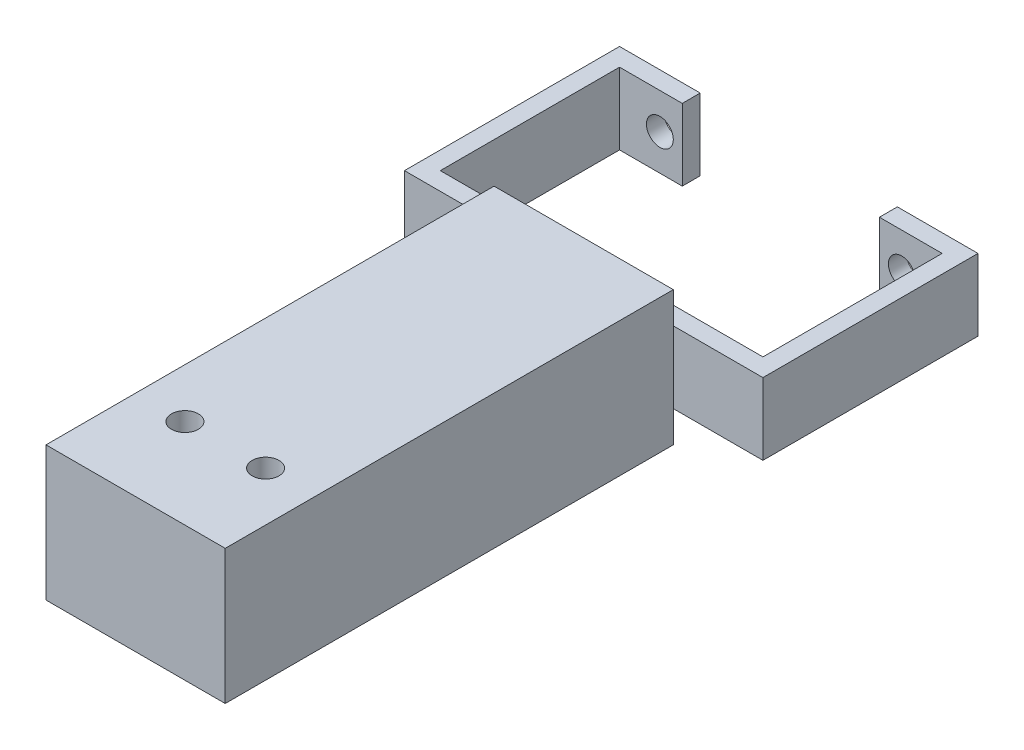
ISO-10303-21;
HEADER;
FILE_DESCRIPTION(('STEP AP214'),'2;1');
FILE_NAME('part.step','',(''),(''),'','','');
FILE_SCHEMA(('AUTOMOTIVE_DESIGN { 1 0 10303 214 1 1 1 1 }'));
ENDSEC;
DATA;
#1=APPLICATION_CONTEXT('core data for automotive mechanical design processes');
#2=APPLICATION_PROTOCOL_DEFINITION('international standard','automotive_design',2000,#1);
#3=PRODUCT_CONTEXT('',#1,'mechanical');
#4=PRODUCT('Part','Part','',(#3));
#5=PRODUCT_RELATED_PRODUCT_CATEGORY('part','',(#4));
#6=PRODUCT_DEFINITION_FORMATION('','',#4);
#7=PRODUCT_DEFINITION_CONTEXT('part definition',#1,'design');
#8=PRODUCT_DEFINITION('design','',#6,#7);
#9=PRODUCT_DEFINITION_SHAPE('','',#8);
#10=(LENGTH_UNIT() NAMED_UNIT(*) SI_UNIT(.MILLI.,.METRE.));
#11=(NAMED_UNIT(*) PLANE_ANGLE_UNIT() SI_UNIT($,.RADIAN.));
#12=(NAMED_UNIT(*) SI_UNIT($,.STERADIAN.) SOLID_ANGLE_UNIT());
#13=UNCERTAINTY_MEASURE_WITH_UNIT(LENGTH_MEASURE(1.E-05),#10,'distance_accuracy_value','');
#14=(GEOMETRIC_REPRESENTATION_CONTEXT(3) GLOBAL_UNCERTAINTY_ASSIGNED_CONTEXT((#13)) GLOBAL_UNIT_ASSIGNED_CONTEXT((#10,
#11,#12)) REPRESENTATION_CONTEXT('',''));
#15=CARTESIAN_POINT('',(0.,0.,0.));
#16=DIRECTION('',(0.,0.,1.));
#17=DIRECTION('',(1.,0.,0.));
#18=AXIS2_PLACEMENT_3D('',#15,#16,#17);
#19=CARTESIAN_POINT('',(0.,0.,24.));
#20=DIRECTION('',(0.,0.,-1.));
#21=DIRECTION('',(-1.,0.,0.));
#22=AXIS2_PLACEMENT_3D('',#19,#20,#21);
#23=PLANE('',#22);
#24=DIRECTION('',(0.,1.,0.));
#25=VECTOR('',#24,1.);
#26=CARTESIAN_POINT('',(10.,7.5,24.));
#27=LINE('',#26,#25);
#28=CARTESIAN_POINT('',(10.,-4.,24.));
#29=VERTEX_POINT('',#28);
#30=CARTESIAN_POINT('',(10.,4.,24.));
#31=VERTEX_POINT('',#30);
#32=EDGE_CURVE('E11',#29,#31,#27,.T.);
#33=ORIENTED_EDGE('',*,*,#32,.F.);
#34=DIRECTION('',(1.,0.,0.));
#35=VECTOR('',#34,1.);
#36=CARTESIAN_POINT('',(20.,-4.,24.));
#37=LINE('',#36,#35);
#38=CARTESIAN_POINT('',(20.,-4.,24.));
#39=VERTEX_POINT('',#38);
#40=EDGE_CURVE('E263',#29,#39,#37,.T.);
#41=ORIENTED_EDGE('',*,*,#40,.T.);
#42=DIRECTION('',(0.,1.,0.));
#43=VECTOR('',#42,1.);
#44=CARTESIAN_POINT('',(20.,4.,24.));
#45=LINE('',#44,#43);
#46=CARTESIAN_POINT('',(20.,4.,24.));
#47=VERTEX_POINT('',#46);
#48=EDGE_CURVE('E261',#39,#47,#45,.T.);
#49=ORIENTED_EDGE('',*,*,#48,.T.);
#50=DIRECTION('',(-1.,0.,0.));
#51=VECTOR('',#50,1.);
#52=CARTESIAN_POINT('',(-20.,4.,24.));
#53=LINE('',#52,#51);
#54=EDGE_CURVE('E267',#47,#31,#53,.T.);
#55=ORIENTED_EDGE('',*,*,#54,.T.);
#56=EDGE_LOOP('',(#33,#41,#49,#55));
#57=FACE_BOUND('',#56,.T.);
#58=ADVANCED_FACE('F38',(#57),#23,.F.);
#59=DIRECTION('',(0.,-1.,0.));
#60=VECTOR('',#59,1.);
#61=CARTESIAN_POINT('',(-10.,7.5,24.));
#62=LINE('',#61,#60);
#63=CARTESIAN_POINT('',(-10.,4.,24.));
#64=VERTEX_POINT('',#63);
#65=CARTESIAN_POINT('',(-10.,-4.,24.));
#66=VERTEX_POINT('',#65);
#67=EDGE_CURVE('E48',#64,#66,#62,.T.);
#68=ORIENTED_EDGE('',*,*,#67,.F.);
#69=CARTESIAN_POINT('',(-20.,4.,24.));
#70=VERTEX_POINT('',#69);
#71=EDGE_CURVE('E266',#64,#70,#53,.T.);
#72=ORIENTED_EDGE('',*,*,#71,.T.);
#73=DIRECTION('',(0.,-1.,0.));
#74=VECTOR('',#73,1.);
#75=CARTESIAN_POINT('',(-20.,-4.,24.));
#76=LINE('',#75,#74);
#77=CARTESIAN_POINT('',(-20.,-4.,24.));
#78=VERTEX_POINT('',#77);
#79=EDGE_CURVE('E270',#70,#78,#76,.T.);
#80=ORIENTED_EDGE('',*,*,#79,.T.);
#81=EDGE_CURVE('E258',#78,#66,#37,.T.);
#82=ORIENTED_EDGE('',*,*,#81,.T.);
#83=EDGE_LOOP('',(#68,#72,#80,#82));
#84=FACE_BOUND('',#83,.T.);
#85=ADVANCED_FACE('F419',(#84),#23,.F.);
#86=CARTESIAN_POINT('',(0.,0.,22.));
#87=DIRECTION('',(0.,0.,-1.));
#88=DIRECTION('',(-1.,0.,0.));
#89=AXIS2_PLACEMENT_3D('',#86,#87,#88);
#90=PLANE('',#89);
#91=DIRECTION('',(-1.,0.,0.));
#92=VECTOR('',#91,1.);
#93=CARTESIAN_POINT('',(-20.,4.,22.));
#94=LINE('',#93,#92);
#95=CARTESIAN_POINT('',(18.,4.,22.));
#96=VERTEX_POINT('',#95);
#97=CARTESIAN_POINT('',(-18.,4.,22.));
#98=VERTEX_POINT('',#97);
#99=EDGE_CURVE('E278',#96,#98,#94,.T.);
#100=ORIENTED_EDGE('',*,*,#99,.F.);
#101=DIRECTION('',(0.,-1.,0.));
#102=VECTOR('',#101,1.);
#103=CARTESIAN_POINT('',(18.,-4.,22.));
#104=LINE('',#103,#102);
#105=CARTESIAN_POINT('',(18.,-4.,22.));
#106=VERTEX_POINT('',#105);
#107=EDGE_CURVE('E201',#96,#106,#104,.T.);
#108=ORIENTED_EDGE('',*,*,#107,.T.);
#109=DIRECTION('',(1.,0.,0.));
#110=VECTOR('',#109,1.);
#111=CARTESIAN_POINT('',(20.,-4.,22.));
#112=LINE('',#111,#110);
#113=CARTESIAN_POINT('',(-18.,-4.,22.));
#114=VERTEX_POINT('',#113);
#115=EDGE_CURVE('E257',#114,#106,#112,.T.);
#116=ORIENTED_EDGE('',*,*,#115,.F.);
#117=DIRECTION('',(0.,1.,0.));
#118=VECTOR('',#117,1.);
#119=CARTESIAN_POINT('',(-18.,4.,22.));
#120=LINE('',#119,#118);
#121=EDGE_CURVE('E287',#114,#98,#120,.T.);
#122=ORIENTED_EDGE('',*,*,#121,.T.);
#123=EDGE_LOOP('',(#100,#108,#116,#122));
#124=FACE_BOUND('',#123,.T.);
#125=ADVANCED_FACE('F425',(#124),#90,.T.);
#126=CARTESIAN_POINT('',(0.,0.,2.));
#127=DIRECTION('',(0.,0.,1.));
#128=DIRECTION('',(1.,0.,0.));
#129=AXIS2_PLACEMENT_3D('',#126,#127,#128);
#130=PLANE('',#129);
#131=DIRECTION('',(0.,1.,0.));
#132=VECTOR('',#131,1.);
#133=CARTESIAN_POINT('',(-18.,4.,2.));
#134=LINE('',#133,#132);
#135=CARTESIAN_POINT('',(-18.,-4.,2.));
#136=VERTEX_POINT('',#135);
#137=CARTESIAN_POINT('',(-18.,4.,2.));
#138=VERTEX_POINT('',#137);
#139=EDGE_CURVE('E286',#136,#138,#134,.T.);
#140=ORIENTED_EDGE('',*,*,#139,.F.);
#141=DIRECTION('',(1.,0.,0.));
#142=VECTOR('',#141,1.);
#143=CARTESIAN_POINT('',(-20.,-4.,2.));
#144=LINE('',#143,#142);
#145=CARTESIAN_POINT('',(-11.,-4.,2.));
#146=VERTEX_POINT('',#145);
#147=EDGE_CURVE('E314',#136,#146,#144,.T.);
#148=ORIENTED_EDGE('',*,*,#147,.T.);
#149=DIRECTION('',(0.,1.,0.));
#150=VECTOR('',#149,1.);
#151=CARTESIAN_POINT('',(-11.,-4.,2.));
#152=LINE('',#151,#150);
#153=CARTESIAN_POINT('',(-11.,4.,2.));
#154=VERTEX_POINT('',#153);
#155=EDGE_CURVE('E318',#146,#154,#152,.T.);
#156=ORIENTED_EDGE('',*,*,#155,.T.);
#157=DIRECTION('',(-1.,0.,0.));
#158=VECTOR('',#157,1.);
#159=CARTESIAN_POINT('',(-11.,4.,2.));
#160=LINE('',#159,#158);
#161=EDGE_CURVE('E311',#154,#138,#160,.T.);
#162=ORIENTED_EDGE('',*,*,#161,.T.);
#163=EDGE_LOOP('',(#140,#148,#156,#162));
#164=FACE_BOUND('',#163,.T.);
#165=CARTESIAN_POINT('',(-13.5,0.,2.));
#166=DIRECTION('',(0.,0.,1.));
#167=DIRECTION('',(1.,0.,0.));
#168=AXIS2_PLACEMENT_3D('',#165,#166,#167);
#169=CIRCLE('',#168,1.5);
#170=CARTESIAN_POINT('',(-12.,0.,2.));
#171=VERTEX_POINT('',#170);
#172=EDGE_CURVE('E303',#171,#171,#169,.T.);
#173=ORIENTED_EDGE('',*,*,#172,.F.);
#174=EDGE_LOOP('',(#173));
#175=FACE_BOUND('',#174,.T.);
#176=ADVANCED_FACE('F432',(#164,#175),#130,.T.);
#177=CARTESIAN_POINT('',(0.,0.,0.));
#178=DIRECTION('',(0.,0.,1.));
#179=DIRECTION('',(1.,0.,0.));
#180=AXIS2_PLACEMENT_3D('',#177,#178,#179);
#181=PLANE('',#180);
#182=DIRECTION('',(-1.,0.,0.));
#183=VECTOR('',#182,1.);
#184=CARTESIAN_POINT('',(-11.,4.,0.));
#185=LINE('',#184,#183);
#186=CARTESIAN_POINT('',(-11.,4.,0.));
#187=VERTEX_POINT('',#186);
#188=CARTESIAN_POINT('',(-20.,4.,0.));
#189=VERTEX_POINT('',#188);
#190=EDGE_CURVE('E307',#187,#189,#185,.T.);
#191=ORIENTED_EDGE('',*,*,#190,.F.);
#192=DIRECTION('',(0.,1.,0.));
#193=VECTOR('',#192,1.);
#194=CARTESIAN_POINT('',(-11.,-4.,0.));
#195=LINE('',#194,#193);
#196=CARTESIAN_POINT('',(-11.,-4.,0.));
#197=VERTEX_POINT('',#196);
#198=EDGE_CURVE('E315',#197,#187,#195,.T.);
#199=ORIENTED_EDGE('',*,*,#198,.F.);
#200=DIRECTION('',(1.,0.,0.));
#201=VECTOR('',#200,1.);
#202=CARTESIAN_POINT('',(-20.,-4.,0.));
#203=LINE('',#202,#201);
#204=CARTESIAN_POINT('',(-20.,-4.,0.));
#205=VERTEX_POINT('',#204);
#206=EDGE_CURVE('E328',#205,#197,#203,.T.);
#207=ORIENTED_EDGE('',*,*,#206,.F.);
#208=DIRECTION('',(0.,-1.,0.));
#209=VECTOR('',#208,1.);
#210=CARTESIAN_POINT('',(-20.,4.,0.));
#211=LINE('',#210,#209);
#212=EDGE_CURVE('E325',#189,#205,#211,.T.);
#213=ORIENTED_EDGE('',*,*,#212,.F.);
#214=EDGE_LOOP('',(#191,#199,#207,#213));
#215=FACE_BOUND('',#214,.T.);
#216=CARTESIAN_POINT('',(-13.5,0.,0.));
#217=DIRECTION('',(0.,0.,1.));
#218=DIRECTION('',(1.,0.,0.));
#219=AXIS2_PLACEMENT_3D('',#216,#217,#218);
#220=CIRCLE('',#219,1.5);
#221=CARTESIAN_POINT('',(-12.,0.,0.));
#222=VERTEX_POINT('',#221);
#223=EDGE_CURVE('E302',#222,#222,#220,.T.);
#224=ORIENTED_EDGE('',*,*,#223,.T.);
#225=EDGE_LOOP('',(#224));
#226=FACE_BOUND('',#225,.T.);
#227=ADVANCED_FACE('F450',(#215,#226),#181,.F.);
#228=CARTESIAN_POINT('',(-11.,4.,2.));
#229=DIRECTION('',(0.,-1.,0.));
#230=DIRECTION('',(0.,0.,-1.));
#231=AXIS2_PLACEMENT_3D('',#228,#229,#230);
#232=PLANE('',#231);
#233=ORIENTED_EDGE('',*,*,#190,.T.);
#234=DIRECTION('',(0.,0.,-1.));
#235=VECTOR('',#234,1.);
#236=CARTESIAN_POINT('',(-20.,4.,2.));
#237=LINE('',#236,#235);
#238=EDGE_CURVE('E42',#70,#189,#237,.T.);
#239=ORIENTED_EDGE('',*,*,#238,.F.);
#240=ORIENTED_EDGE('',*,*,#71,.F.);
#241=EDGE_CURVE('E64',#31,#64,#53,.T.);
#242=ORIENTED_EDGE('',*,*,#241,.F.);
#243=ORIENTED_EDGE('',*,*,#54,.F.);
#244=DIRECTION('',(0.,0.,-1.));
#245=VECTOR('',#244,1.);
#246=CARTESIAN_POINT('',(20.,4.,24.));
#247=LINE('',#246,#245);
#248=CARTESIAN_POINT('',(20.,4.,0.));
#249=VERTEX_POINT('',#248);
#250=EDGE_CURVE('E274',#47,#249,#247,.T.);
#251=ORIENTED_EDGE('',*,*,#250,.T.);
#252=DIRECTION('',(-1.,0.,0.));
#253=VECTOR('',#252,1.);
#254=CARTESIAN_POINT('',(11.,4.,0.));
#255=LINE('',#254,#253);
#256=CARTESIAN_POINT('',(11.,4.,0.));
#257=VERTEX_POINT('',#256);
#258=EDGE_CURVE('E245',#249,#257,#255,.T.);
#259=ORIENTED_EDGE('',*,*,#258,.T.);
#260=DIRECTION('',(0.,0.,-1.));
#261=VECTOR('',#260,1.);
#262=CARTESIAN_POINT('',(11.,4.,2.));
#263=LINE('',#262,#261);
#264=CARTESIAN_POINT('',(11.,4.,2.));
#265=VERTEX_POINT('',#264);
#266=EDGE_CURVE('E253',#265,#257,#263,.T.);
#267=ORIENTED_EDGE('',*,*,#266,.F.);
#268=DIRECTION('',(-1.,0.,0.));
#269=VECTOR('',#268,1.);
#270=CARTESIAN_POINT('',(11.,4.,2.));
#271=LINE('',#270,#269);
#272=CARTESIAN_POINT('',(18.,4.,2.));
#273=VERTEX_POINT('',#272);
#274=EDGE_CURVE('E230',#273,#265,#271,.T.);
#275=ORIENTED_EDGE('',*,*,#274,.F.);
#276=DIRECTION('',(0.,0.,-1.));
#277=VECTOR('',#276,1.);
#278=CARTESIAN_POINT('',(18.,4.,22.));
#279=LINE('',#278,#277);
#280=EDGE_CURVE('E214',#96,#273,#279,.T.);
#281=ORIENTED_EDGE('',*,*,#280,.F.);
#282=ORIENTED_EDGE('',*,*,#99,.T.);
#283=DIRECTION('',(0.,0.,-1.));
#284=VECTOR('',#283,1.);
#285=CARTESIAN_POINT('',(-18.,4.,22.));
#286=LINE('',#285,#284);
#287=EDGE_CURVE('E291',#98,#138,#286,.T.);
#288=ORIENTED_EDGE('',*,*,#287,.T.);
#289=ORIENTED_EDGE('',*,*,#161,.F.);
#290=DIRECTION('',(0.,0.,-1.));
#291=VECTOR('',#290,1.);
#292=CARTESIAN_POINT('',(-11.,4.,2.));
#293=LINE('',#292,#291);
#294=EDGE_CURVE('E321',#154,#187,#293,.T.);
#295=ORIENTED_EDGE('',*,*,#294,.T.);
#296=EDGE_LOOP('',(#233,#239,#240,#242,#243,#251,#259,#267,#275,#281,#282,#288,#289,#295));
#297=FACE_BOUND('',#296,.T.);
#298=ADVANCED_FACE('F40',(#297),#232,.F.);
#299=CARTESIAN_POINT('',(-20.,4.,2.));
#300=DIRECTION('',(1.,0.,0.));
#301=DIRECTION('',(0.,0.,-1.));
#302=AXIS2_PLACEMENT_3D('',#299,#300,#301);
#303=PLANE('',#302);
#304=ORIENTED_EDGE('',*,*,#212,.T.);
#305=DIRECTION('',(0.,0.,-1.));
#306=VECTOR('',#305,1.);
#307=CARTESIAN_POINT('',(-20.,-4.,2.));
#308=LINE('',#307,#306);
#309=EDGE_CURVE('E339',#78,#205,#308,.T.);
#310=ORIENTED_EDGE('',*,*,#309,.F.);
#311=ORIENTED_EDGE('',*,*,#79,.F.);
#312=ORIENTED_EDGE('',*,*,#238,.T.);
#313=EDGE_LOOP('',(#304,#310,#311,#312));
#314=FACE_BOUND('',#313,.T.);
#315=ADVANCED_FACE('F460',(#314),#303,.F.);
#316=CARTESIAN_POINT('',(-20.,-4.,2.));
#317=DIRECTION('',(0.,1.,0.));
#318=DIRECTION('',(0.,0.,1.));
#319=AXIS2_PLACEMENT_3D('',#316,#317,#318);
#320=PLANE('',#319);
#321=ORIENTED_EDGE('',*,*,#206,.T.);
#322=DIRECTION('',(0.,0.,-1.));
#323=VECTOR('',#322,1.);
#324=CARTESIAN_POINT('',(-11.,-4.,2.));
#325=LINE('',#324,#323);
#326=EDGE_CURVE('E336',#146,#197,#325,.T.);
#327=ORIENTED_EDGE('',*,*,#326,.F.);
#328=ORIENTED_EDGE('',*,*,#147,.F.);
#329=DIRECTION('',(0.,0.,-1.));
#330=VECTOR('',#329,1.);
#331=CARTESIAN_POINT('',(-18.,-4.,22.));
#332=LINE('',#331,#330);
#333=EDGE_CURVE('E298',#114,#136,#332,.T.);
#334=ORIENTED_EDGE('',*,*,#333,.F.);
#335=ORIENTED_EDGE('',*,*,#115,.T.);
#336=DIRECTION('',(0.,0.,-1.));
#337=VECTOR('',#336,1.);
#338=CARTESIAN_POINT('',(18.,-4.,22.));
#339=LINE('',#338,#337);
#340=CARTESIAN_POINT('',(18.,-4.,2.));
#341=VERTEX_POINT('',#340);
#342=EDGE_CURVE('E209',#106,#341,#339,.T.);
#343=ORIENTED_EDGE('',*,*,#342,.T.);
#344=DIRECTION('',(1.,0.,0.));
#345=VECTOR('',#344,1.);
#346=CARTESIAN_POINT('',(20.,-4.,2.));
#347=LINE('',#346,#345);
#348=CARTESIAN_POINT('',(11.,-4.,2.));
#349=VERTEX_POINT('',#348);
#350=EDGE_CURVE('E227',#349,#341,#347,.T.);
#351=ORIENTED_EDGE('',*,*,#350,.F.);
#352=DIRECTION('',(0.,0.,-1.));
#353=VECTOR('',#352,1.);
#354=CARTESIAN_POINT('',(11.,-4.,2.));
#355=LINE('',#354,#353);
#356=CARTESIAN_POINT('',(11.,-4.,0.));
#357=VERTEX_POINT('',#356);
#358=EDGE_CURVE('E237',#349,#357,#355,.T.);
#359=ORIENTED_EDGE('',*,*,#358,.T.);
#360=DIRECTION('',(1.,0.,0.));
#361=VECTOR('',#360,1.);
#362=CARTESIAN_POINT('',(20.,-4.,0.));
#363=LINE('',#362,#361);
#364=CARTESIAN_POINT('',(20.,-4.,0.));
#365=VERTEX_POINT('',#364);
#366=EDGE_CURVE('E223',#357,#365,#363,.T.);
#367=ORIENTED_EDGE('',*,*,#366,.T.);
#368=DIRECTION('',(0.,0.,-1.));
#369=VECTOR('',#368,1.);
#370=CARTESIAN_POINT('',(20.,-4.,24.));
#371=LINE('',#370,#369);
#372=EDGE_CURVE('E283',#39,#365,#371,.T.);
#373=ORIENTED_EDGE('',*,*,#372,.F.);
#374=ORIENTED_EDGE('',*,*,#40,.F.);
#375=EDGE_CURVE('E262',#66,#29,#37,.T.);
#376=ORIENTED_EDGE('',*,*,#375,.F.);
#377=ORIENTED_EDGE('',*,*,#81,.F.);
#378=ORIENTED_EDGE('',*,*,#309,.T.);
#379=EDGE_LOOP('',(#321,#327,#328,#334,#335,#343,#351,#359,#367,#373,#374,#376,#377,#378));
#380=FACE_BOUND('',#379,.T.);
#381=ADVANCED_FACE('F457',(#380),#320,.F.);
#382=CARTESIAN_POINT('',(-11.,-4.,2.));
#383=DIRECTION('',(-1.,0.,0.));
#384=DIRECTION('',(0.,0.,1.));
#385=AXIS2_PLACEMENT_3D('',#382,#383,#384);
#386=PLANE('',#385);
#387=ORIENTED_EDGE('',*,*,#198,.T.);
#388=ORIENTED_EDGE('',*,*,#294,.F.);
#389=ORIENTED_EDGE('',*,*,#155,.F.);
#390=ORIENTED_EDGE('',*,*,#326,.T.);
#391=EDGE_LOOP('',(#387,#388,#389,#390));
#392=FACE_BOUND('',#391,.T.);
#393=ADVANCED_FACE('F446',(#392),#386,.F.);
#394=CARTESIAN_POINT('',(-13.5,0.,2.));
#395=DIRECTION('',(0.,0.,-1.));
#396=DIRECTION('',(-1.,0.,0.));
#397=AXIS2_PLACEMENT_3D('',#394,#395,#396);
#398=CYLINDRICAL_SURFACE('',#397,1.5);
#399=ORIENTED_EDGE('',*,*,#172,.T.);
#400=EDGE_LOOP('',(#399));
#401=FACE_BOUND('',#400,.T.);
#402=ORIENTED_EDGE('',*,*,#223,.F.);
#403=EDGE_LOOP('',(#402));
#404=FACE_BOUND('',#403,.T.);
#405=ADVANCED_FACE('F442',(#401,#404),#398,.F.);
#406=CARTESIAN_POINT('',(-18.,4.,22.));
#407=DIRECTION('',(-1.,0.,0.));
#408=DIRECTION('',(0.,0.,1.));
#409=AXIS2_PLACEMENT_3D('',#406,#407,#408);
#410=PLANE('',#409);
#411=ORIENTED_EDGE('',*,*,#139,.T.);
#412=ORIENTED_EDGE('',*,*,#287,.F.);
#413=ORIENTED_EDGE('',*,*,#121,.F.);
#414=ORIENTED_EDGE('',*,*,#333,.T.);
#415=EDGE_LOOP('',(#411,#412,#413,#414));
#416=FACE_BOUND('',#415,.T.);
#417=ADVANCED_FACE('F438',(#416),#410,.F.);
#418=CARTESIAN_POINT('',(20.,4.,24.));
#419=DIRECTION('',(-1.,0.,0.));
#420=DIRECTION('',(0.,0.,1.));
#421=AXIS2_PLACEMENT_3D('',#418,#419,#420);
#422=PLANE('',#421);
#423=ORIENTED_EDGE('',*,*,#372,.T.);
#424=DIRECTION('',(0.,1.,0.));
#425=VECTOR('',#424,1.);
#426=CARTESIAN_POINT('',(20.,4.,0.));
#427=LINE('',#426,#425);
#428=EDGE_CURVE('E241',#365,#249,#427,.T.);
#429=ORIENTED_EDGE('',*,*,#428,.T.);
#430=ORIENTED_EDGE('',*,*,#250,.F.);
#431=ORIENTED_EDGE('',*,*,#48,.F.);
#432=EDGE_LOOP('',(#423,#429,#430,#431));
#433=FACE_BOUND('',#432,.T.);
#434=ADVANCED_FACE('F434',(#433),#422,.F.);
#435=CARTESIAN_POINT('',(0.,0.,2.));
#436=DIRECTION('',(0.,0.,-1.));
#437=DIRECTION('',(-1.,0.,0.));
#438=AXIS2_PLACEMENT_3D('',#435,#436,#437);
#439=PLANE('',#438);
#440=CARTESIAN_POINT('',(13.5,0.,2.));
#441=DIRECTION('',(0.,0.,1.));
#442=DIRECTION('',(1.,0.,0.));
#443=AXIS2_PLACEMENT_3D('',#440,#441,#442);
#444=CIRCLE('',#443,1.5);
#445=CARTESIAN_POINT('',(15.,0.,2.));
#446=VERTEX_POINT('',#445);
#447=EDGE_CURVE('E219',#446,#446,#444,.T.);
#448=ORIENTED_EDGE('',*,*,#447,.F.);
#449=EDGE_LOOP('',(#448));
#450=FACE_BOUND('',#449,.T.);
#451=DIRECTION('',(0.,-1.,0.));
#452=VECTOR('',#451,1.);
#453=CARTESIAN_POINT('',(18.,-4.,2.));
#454=LINE('',#453,#452);
#455=EDGE_CURVE('E196',#273,#341,#454,.T.);
#456=ORIENTED_EDGE('',*,*,#455,.F.);
#457=ORIENTED_EDGE('',*,*,#274,.T.);
#458=DIRECTION('',(0.,-1.,0.));
#459=VECTOR('',#458,1.);
#460=CARTESIAN_POINT('',(11.,-4.,2.));
#461=LINE('',#460,#459);
#462=EDGE_CURVE('E234',#265,#349,#461,.T.);
#463=ORIENTED_EDGE('',*,*,#462,.T.);
#464=ORIENTED_EDGE('',*,*,#350,.T.);
#465=EDGE_LOOP('',(#456,#457,#463,#464));
#466=FACE_BOUND('',#465,.T.);
#467=ADVANCED_FACE('F437',(#450,#466),#439,.F.);
#468=CARTESIAN_POINT('',(0.,0.,0.));
#469=DIRECTION('',(0.,0.,-1.));
#470=DIRECTION('',(-1.,0.,0.));
#471=AXIS2_PLACEMENT_3D('',#468,#469,#470);
#472=PLANE('',#471);
#473=ORIENTED_EDGE('',*,*,#366,.F.);
#474=DIRECTION('',(0.,-1.,0.));
#475=VECTOR('',#474,1.);
#476=CARTESIAN_POINT('',(11.,-4.,0.));
#477=LINE('',#476,#475);
#478=EDGE_CURVE('E231',#257,#357,#477,.T.);
#479=ORIENTED_EDGE('',*,*,#478,.F.);
#480=ORIENTED_EDGE('',*,*,#258,.F.);
#481=ORIENTED_EDGE('',*,*,#428,.F.);
#482=EDGE_LOOP('',(#473,#479,#480,#481));
#483=FACE_BOUND('',#482,.T.);
#484=CARTESIAN_POINT('',(13.5,0.,0.));
#485=DIRECTION('',(0.,0.,1.));
#486=DIRECTION('',(1.,0.,0.));
#487=AXIS2_PLACEMENT_3D('',#484,#485,#486);
#488=CIRCLE('',#487,1.5);
#489=CARTESIAN_POINT('',(15.,0.,0.));
#490=VERTEX_POINT('',#489);
#491=EDGE_CURVE('E218',#490,#490,#488,.T.);
#492=ORIENTED_EDGE('',*,*,#491,.T.);
#493=EDGE_LOOP('',(#492));
#494=FACE_BOUND('',#493,.T.);
#495=ADVANCED_FACE('F494',(#483,#494),#472,.T.);
#496=CARTESIAN_POINT('',(11.,-4.,2.));
#497=DIRECTION('',(1.,0.,0.));
#498=DIRECTION('',(0.,0.,-1.));
#499=AXIS2_PLACEMENT_3D('',#496,#497,#498);
#500=PLANE('',#499);
#501=ORIENTED_EDGE('',*,*,#478,.T.);
#502=ORIENTED_EDGE('',*,*,#358,.F.);
#503=ORIENTED_EDGE('',*,*,#462,.F.);
#504=ORIENTED_EDGE('',*,*,#266,.T.);
#505=EDGE_LOOP('',(#501,#502,#503,#504));
#506=FACE_BOUND('',#505,.T.);
#507=ADVANCED_FACE('F428',(#506),#500,.F.);
#508=CARTESIAN_POINT('',(13.5,0.,2.));
#509=DIRECTION('',(0.,0.,-1.));
#510=DIRECTION('',(-1.,0.,0.));
#511=AXIS2_PLACEMENT_3D('',#508,#509,#510);
#512=CYLINDRICAL_SURFACE('',#511,1.5);
#513=ORIENTED_EDGE('',*,*,#447,.T.);
#514=EDGE_LOOP('',(#513));
#515=FACE_BOUND('',#514,.T.);
#516=ORIENTED_EDGE('',*,*,#491,.F.);
#517=EDGE_LOOP('',(#516));
#518=FACE_BOUND('',#517,.T.);
#519=ADVANCED_FACE('F525',(#515,#518),#512,.F.);
#520=CARTESIAN_POINT('',(18.,-4.,22.));
#521=DIRECTION('',(1.,0.,0.));
#522=DIRECTION('',(0.,0.,-1.));
#523=AXIS2_PLACEMENT_3D('',#520,#521,#522);
#524=PLANE('',#523);
#525=ORIENTED_EDGE('',*,*,#455,.T.);
#526=ORIENTED_EDGE('',*,*,#342,.F.);
#527=ORIENTED_EDGE('',*,*,#107,.F.);
#528=ORIENTED_EDGE('',*,*,#280,.T.);
#529=EDGE_LOOP('',(#525,#526,#527,#528));
#530=FACE_BOUND('',#529,.T.);
#531=ADVANCED_FACE('F481',(#530),#524,.F.);
#532=CARTESIAN_POINT('',(0.,0.,24.));
#533=DIRECTION('',(0.,0.,-1.));
#534=DIRECTION('',(-1.,0.,0.));
#535=AXIS2_PLACEMENT_3D('',#532,#533,#534);
#536=PLANE('',#535);
#537=CARTESIAN_POINT('',(-10.,-7.5,24.));
#538=VERTEX_POINT('',#537);
#539=EDGE_CURVE('E353',#66,#538,#62,.T.);
#540=ORIENTED_EDGE('',*,*,#539,.F.);
#541=ORIENTED_EDGE('',*,*,#375,.T.);
#542=CARTESIAN_POINT('',(10.,-7.5,24.));
#543=VERTEX_POINT('',#542);
#544=EDGE_CURVE('E50',#543,#29,#27,.T.);
#545=ORIENTED_EDGE('',*,*,#544,.F.);
#546=DIRECTION('',(1.,0.,0.));
#547=VECTOR('',#546,1.);
#548=CARTESIAN_POINT('',(10.,-7.5,24.));
#549=LINE('',#548,#547);
#550=EDGE_CURVE('E189',#538,#543,#549,.T.);
#551=ORIENTED_EDGE('',*,*,#550,.F.);
#552=EDGE_LOOP('',(#540,#541,#545,#551));
#553=FACE_BOUND('',#552,.T.);
#554=ADVANCED_FACE('F415',(#553),#536,.T.);
#555=CARTESIAN_POINT('',(10.,7.5,74.));
#556=DIRECTION('',(-1.,0.,0.));
#557=DIRECTION('',(0.,0.,1.));
#558=AXIS2_PLACEMENT_3D('',#555,#556,#557);
#559=PLANE('',#558);
#560=ORIENTED_EDGE('',*,*,#544,.T.);
#561=ORIENTED_EDGE('',*,*,#32,.T.);
#562=CARTESIAN_POINT('',(10.,7.5,24.));
#563=VERTEX_POINT('',#562);
#564=EDGE_CURVE('E51',#31,#563,#27,.T.);
#565=ORIENTED_EDGE('',*,*,#564,.T.);
#566=DIRECTION('',(0.,0.,-1.));
#567=VECTOR('',#566,1.);
#568=CARTESIAN_POINT('',(10.,7.5,74.));
#569=LINE('',#568,#567);
#570=CARTESIAN_POINT('',(10.,7.5,74.));
#571=VERTEX_POINT('',#570);
#572=EDGE_CURVE('E172',#571,#563,#569,.T.);
#573=ORIENTED_EDGE('',*,*,#572,.F.);
#574=DIRECTION('',(0.,1.,0.));
#575=VECTOR('',#574,1.);
#576=CARTESIAN_POINT('',(10.,7.5,74.));
#577=LINE('',#576,#575);
#578=CARTESIAN_POINT('',(10.,-7.5,74.));
#579=VERTEX_POINT('',#578);
#580=EDGE_CURVE('E179',#579,#571,#577,.T.);
#581=ORIENTED_EDGE('',*,*,#580,.F.);
#582=DIRECTION('',(0.,0.,-1.));
#583=VECTOR('',#582,1.);
#584=CARTESIAN_POINT('',(10.,-7.5,74.));
#585=LINE('',#584,#583);
#586=EDGE_CURVE('E369',#579,#543,#585,.T.);
#587=ORIENTED_EDGE('',*,*,#586,.T.);
#588=EDGE_LOOP('',(#560,#561,#565,#573,#581,#587));
#589=FACE_BOUND('',#588,.T.);
#590=ADVANCED_FACE('F192',(#589),#559,.F.);
#591=CARTESIAN_POINT('',(-10.,7.5,74.));
#592=DIRECTION('',(0.,-1.,0.));
#593=DIRECTION('',(0.,0.,-1.));
#594=AXIS2_PLACEMENT_3D('',#591,#592,#593);
#595=PLANE('',#594);
#596=CARTESIAN_POINT('',(-4.5,7.5,64.));
#597=DIRECTION('',(0.,1.,0.));
#598=DIRECTION('',(0.,0.,1.));
#599=AXIS2_PLACEMENT_3D('',#596,#597,#598);
#600=CIRCLE('',#599,1.5);
#601=CARTESIAN_POINT('',(-4.5,7.5,65.5));
#602=VERTEX_POINT('',#601);
#603=EDGE_CURVE('E380',#602,#602,#600,.T.);
#604=ORIENTED_EDGE('',*,*,#603,.F.);
#605=EDGE_LOOP('',(#604));
#606=FACE_BOUND('',#605,.T.);
#607=CARTESIAN_POINT('',(4.5,7.5,64.));
#608=DIRECTION('',(0.,1.,0.));
#609=DIRECTION('',(0.,0.,1.));
#610=AXIS2_PLACEMENT_3D('',#607,#608,#609);
#611=CIRCLE('',#610,1.5);
#612=CARTESIAN_POINT('',(4.5,7.5,65.5));
#613=VERTEX_POINT('',#612);
#614=EDGE_CURVE('E372',#613,#613,#611,.T.);
#615=ORIENTED_EDGE('',*,*,#614,.F.);
#616=EDGE_LOOP('',(#615));
#617=FACE_BOUND('',#616,.T.);
#618=DIRECTION('',(-1.,0.,0.));
#619=VECTOR('',#618,1.);
#620=CARTESIAN_POINT('',(-10.,7.5,24.));
#621=LINE('',#620,#619);
#622=CARTESIAN_POINT('',(-10.,7.5,24.));
#623=VERTEX_POINT('',#622);
#624=EDGE_CURVE('E360',#563,#623,#621,.T.);
#625=ORIENTED_EDGE('',*,*,#624,.T.);
#626=DIRECTION('',(0.,0.,-1.));
#627=VECTOR('',#626,1.);
#628=CARTESIAN_POINT('',(-10.,7.5,74.));
#629=LINE('',#628,#627);
#630=CARTESIAN_POINT('',(-10.,7.5,74.));
#631=VERTEX_POINT('',#630);
#632=EDGE_CURVE('E174',#631,#623,#629,.T.);
#633=ORIENTED_EDGE('',*,*,#632,.F.);
#634=DIRECTION('',(-1.,0.,0.));
#635=VECTOR('',#634,1.);
#636=CARTESIAN_POINT('',(-10.,7.5,74.));
#637=LINE('',#636,#635);
#638=EDGE_CURVE('E168',#571,#631,#637,.T.);
#639=ORIENTED_EDGE('',*,*,#638,.F.);
#640=ORIENTED_EDGE('',*,*,#572,.T.);
#641=EDGE_LOOP('',(#625,#633,#639,#640));
#642=FACE_BOUND('',#641,.T.);
#643=ADVANCED_FACE('F170',(#606,#617,#642),#595,.F.);
#644=CARTESIAN_POINT('',(-10.,7.5,74.));
#645=DIRECTION('',(1.,0.,0.));
#646=DIRECTION('',(0.,0.,-1.));
#647=AXIS2_PLACEMENT_3D('',#644,#645,#646);
#648=PLANE('',#647);
#649=EDGE_CURVE('E352',#623,#64,#62,.T.);
#650=ORIENTED_EDGE('',*,*,#649,.T.);
#651=ORIENTED_EDGE('',*,*,#67,.T.);
#652=ORIENTED_EDGE('',*,*,#539,.T.);
#653=DIRECTION('',(0.,0.,-1.));
#654=VECTOR('',#653,1.);
#655=CARTESIAN_POINT('',(-10.,-7.5,74.));
#656=LINE('',#655,#654);
#657=CARTESIAN_POINT('',(-10.,-7.5,74.));
#658=VERTEX_POINT('',#657);
#659=EDGE_CURVE('E203',#658,#538,#656,.T.);
#660=ORIENTED_EDGE('',*,*,#659,.F.);
#661=DIRECTION('',(0.,-1.,0.));
#662=VECTOR('',#661,1.);
#663=CARTESIAN_POINT('',(-10.,7.5,74.));
#664=LINE('',#663,#662);
#665=EDGE_CURVE('E178',#631,#658,#664,.T.);
#666=ORIENTED_EDGE('',*,*,#665,.F.);
#667=ORIENTED_EDGE('',*,*,#632,.T.);
#668=EDGE_LOOP('',(#650,#651,#652,#660,#666,#667));
#669=FACE_BOUND('',#668,.T.);
#670=ADVANCED_FACE('F402',(#669),#648,.F.);
#671=CARTESIAN_POINT('',(10.,-7.5,74.));
#672=DIRECTION('',(0.,1.,0.));
#673=DIRECTION('',(0.,0.,1.));
#674=AXIS2_PLACEMENT_3D('',#671,#672,#673);
#675=PLANE('',#674);
#676=CARTESIAN_POINT('',(-4.5,-7.5,64.));
#677=DIRECTION('',(0.,1.,0.));
#678=DIRECTION('',(0.,0.,1.));
#679=AXIS2_PLACEMENT_3D('',#676,#677,#678);
#680=CIRCLE('',#679,1.5);
#681=CARTESIAN_POINT('',(-4.5,-7.5,65.5));
#682=VERTEX_POINT('',#681);
#683=EDGE_CURVE('E384',#682,#682,#680,.T.);
#684=ORIENTED_EDGE('',*,*,#683,.T.);
#685=EDGE_LOOP('',(#684));
#686=FACE_BOUND('',#685,.T.);
#687=CARTESIAN_POINT('',(4.5,-7.5,64.));
#688=DIRECTION('',(0.,1.,0.));
#689=DIRECTION('',(0.,0.,1.));
#690=AXIS2_PLACEMENT_3D('',#687,#688,#689);
#691=CIRCLE('',#690,1.5);
#692=CARTESIAN_POINT('',(4.5,-7.5,65.5));
#693=VERTEX_POINT('',#692);
#694=EDGE_CURVE('E376',#693,#693,#691,.T.);
#695=ORIENTED_EDGE('',*,*,#694,.T.);
#696=EDGE_LOOP('',(#695));
#697=FACE_BOUND('',#696,.T.);
#698=ORIENTED_EDGE('',*,*,#550,.T.);
#699=ORIENTED_EDGE('',*,*,#586,.F.);
#700=DIRECTION('',(1.,0.,0.));
#701=VECTOR('',#700,1.);
#702=CARTESIAN_POINT('',(10.,-7.5,74.));
#703=LINE('',#702,#701);
#704=EDGE_CURVE('E184',#658,#579,#703,.T.);
#705=ORIENTED_EDGE('',*,*,#704,.F.);
#706=ORIENTED_EDGE('',*,*,#659,.T.);
#707=EDGE_LOOP('',(#698,#699,#705,#706));
#708=FACE_BOUND('',#707,.T.);
#709=ADVANCED_FACE('F390',(#686,#697,#708),#675,.F.);
#710=CARTESIAN_POINT('',(0.,0.,74.));
#711=DIRECTION('',(0.,0.,-1.));
#712=DIRECTION('',(-1.,0.,0.));
#713=AXIS2_PLACEMENT_3D('',#710,#711,#712);
#714=PLANE('',#713);
#715=ORIENTED_EDGE('',*,*,#580,.T.);
#716=ORIENTED_EDGE('',*,*,#638,.T.);
#717=ORIENTED_EDGE('',*,*,#665,.T.);
#718=ORIENTED_EDGE('',*,*,#704,.T.);
#719=EDGE_LOOP('',(#715,#716,#717,#718));
#720=FACE_BOUND('',#719,.T.);
#721=ADVANCED_FACE('F182',(#720),#714,.F.);
#722=ORIENTED_EDGE('',*,*,#564,.F.);
#723=ORIENTED_EDGE('',*,*,#241,.T.);
#724=ORIENTED_EDGE('',*,*,#649,.F.);
#725=ORIENTED_EDGE('',*,*,#624,.F.);
#726=EDGE_LOOP('',(#722,#723,#724,#725));
#727=FACE_BOUND('',#726,.T.);
#728=ADVANCED_FACE('F407',(#727),#536,.T.);
#729=CARTESIAN_POINT('',(4.5,-7.5,64.));
#730=DIRECTION('',(0.,1.,0.));
#731=DIRECTION('',(0.,0.,1.));
#732=AXIS2_PLACEMENT_3D('',#729,#730,#731);
#733=CYLINDRICAL_SURFACE('',#732,1.5);
#734=ORIENTED_EDGE('',*,*,#694,.F.);
#735=EDGE_LOOP('',(#734));
#736=FACE_BOUND('',#735,.T.);
#737=ORIENTED_EDGE('',*,*,#614,.T.);
#738=EDGE_LOOP('',(#737));
#739=FACE_BOUND('',#738,.T.);
#740=ADVANCED_FACE('F396',(#736,#739),#733,.F.);
#741=CARTESIAN_POINT('',(-4.5,-7.5,64.));
#742=DIRECTION('',(0.,1.,0.));
#743=DIRECTION('',(0.,0.,1.));
#744=AXIS2_PLACEMENT_3D('',#741,#742,#743);
#745=CYLINDRICAL_SURFACE('',#744,1.5);
#746=ORIENTED_EDGE('',*,*,#683,.F.);
#747=EDGE_LOOP('',(#746));
#748=FACE_BOUND('',#747,.T.);
#749=ORIENTED_EDGE('',*,*,#603,.T.);
#750=EDGE_LOOP('',(#749));
#751=FACE_BOUND('',#750,.T.);
#752=ADVANCED_FACE('F393',(#748,#751),#745,.F.);
#753=CLOSED_SHELL('',(#58,#85,#125,#176,#227,#298,#315,#381,#393,#405,#417,#434,#467,#495,#507,
#519,#531,#554,#590,#643,#670,#709,#721,#728,#740,#752));
#754=MANIFOLD_SOLID_BREP('B2',#753);
#755=ADVANCED_BREP_SHAPE_REPRESENTATION('',(#18,#754),#14);
#756=SHAPE_DEFINITION_REPRESENTATION(#9,#755);
ENDSEC;
END-ISO-10303-21;
